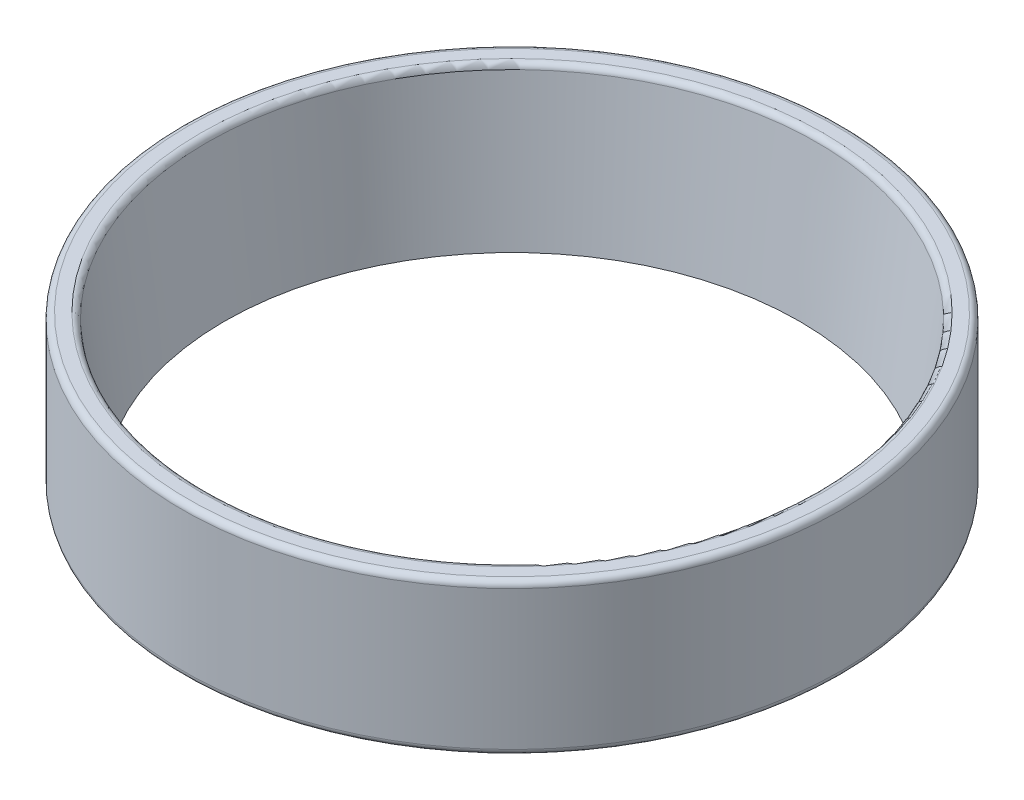
ISO-10303-21;
HEADER;
FILE_DESCRIPTION(('STEP AP214'),'2;1');
FILE_NAME('part.step','',(''),(''),'','','');
FILE_SCHEMA(('AUTOMOTIVE_DESIGN { 1 0 10303 214 1 1 1 1 }'));
ENDSEC;
DATA;
#1=APPLICATION_CONTEXT('core data for automotive mechanical design processes');
#2=APPLICATION_PROTOCOL_DEFINITION('international standard','automotive_design',2000,#1);
#3=PRODUCT_CONTEXT('',#1,'mechanical');
#4=PRODUCT('Part','Part','',(#3));
#5=PRODUCT_RELATED_PRODUCT_CATEGORY('part','',(#4));
#6=PRODUCT_DEFINITION_FORMATION('','',#4);
#7=PRODUCT_DEFINITION_CONTEXT('part definition',#1,'design');
#8=PRODUCT_DEFINITION('design','',#6,#7);
#9=PRODUCT_DEFINITION_SHAPE('','',#8);
#10=(LENGTH_UNIT() NAMED_UNIT(*) SI_UNIT(.MILLI.,.METRE.));
#11=(NAMED_UNIT(*) PLANE_ANGLE_UNIT() SI_UNIT($,.RADIAN.));
#12=(NAMED_UNIT(*) SI_UNIT($,.STERADIAN.) SOLID_ANGLE_UNIT());
#13=UNCERTAINTY_MEASURE_WITH_UNIT(LENGTH_MEASURE(1.E-05),#10,'distance_accuracy_value','');
#14=(GEOMETRIC_REPRESENTATION_CONTEXT(3) GLOBAL_UNCERTAINTY_ASSIGNED_CONTEXT((#13)) GLOBAL_UNIT_ASSIGNED_CONTEXT((#10,
#11,#12)) REPRESENTATION_CONTEXT('',''));
#15=CARTESIAN_POINT('',(0.,0.,0.));
#16=DIRECTION('',(0.,0.,1.));
#17=DIRECTION('',(1.,0.,0.));
#18=AXIS2_PLACEMENT_3D('',#15,#16,#17);
#19=CARTESIAN_POINT('',(0.,18.378788658111,4.44089209850063E-13));
#20=DIRECTION('',(0.,1.,0.));
#21=DIRECTION('',(-1.,0.,0.));
#22=AXIS2_PLACEMENT_3D('',#19,#20,#21);
#23=CONICAL_SURFACE('',#22,38.4004546389734,0.119428926018338);
#24=CARTESIAN_POINT('',(0.,18.378788658111,4.44089209850063E-13));
#25=DIRECTION('',(0.,1.,0.));
#26=DIRECTION('',(-1.,0.,0.));
#27=AXIS2_PLACEMENT_3D('',#24,#25,#26);
#28=CIRCLE('',#27,38.4004546389733);
#29=CARTESIAN_POINT('',(-38.4004546389734,18.378788658111,4.44089209850063E-13));
#30=VERTEX_POINT('',#29);
#31=EDGE_CURVE('E151',#30,#30,#28,.F.);
#32=ORIENTED_EDGE('',*,*,#31,.F.);
#33=EDGE_LOOP('',(#32));
#34=FACE_BOUND('',#33,.T.);
#35=CARTESIAN_POINT('',(0.,0.,0.));
#36=DIRECTION('',(0.,1.,0.));
#37=DIRECTION('',(-1.,0.,0.));
#38=AXIS2_PLACEMENT_3D('',#35,#36,#37);
#39=CIRCLE('',#38,36.195);
#40=CARTESIAN_POINT('',(-36.195,0.,0.));
#41=VERTEX_POINT('',#40);
#42=EDGE_CURVE('E148',#41,#41,#39,.T.);
#43=ORIENTED_EDGE('',*,*,#42,.F.);
#44=EDGE_LOOP('',(#43));
#45=FACE_BOUND('',#44,.T.);
#46=ADVANCED_FACE('F17',(#34,#45),#23,.F.);
#47=CARTESIAN_POINT('',(0.,18.2880000000002,4.44089209850063E-13));
#48=DIRECTION('',(0.,1.,0.));
#49=DIRECTION('',(-1.,0.,0.));
#50=AXIS2_PLACEMENT_3D('',#47,#48,#49);
#51=TOROIDAL_SURFACE('',#50,39.1570267899,0.762);
#52=ORIENTED_EDGE('',*,*,#31,.T.);
#53=EDGE_LOOP('',(#52));
#54=FACE_BOUND('',#53,.T.);
#55=CARTESIAN_POINT('',(0.,19.0500000000002,4.43793113369395E-13));
#56=DIRECTION('',(0.,1.,0.));
#57=DIRECTION('',(-1.,0.,0.));
#58=AXIS2_PLACEMENT_3D('',#55,#56,#57);
#59=CIRCLE('',#58,39.1570267899);
#60=CARTESIAN_POINT('',(39.1570267899009,19.0499999999999,0.));
#61=VERTEX_POINT('',#60);
#62=CARTESIAN_POINT('',(-39.1570267899004,19.0500000000001,8.88178419700125E-13));
#63=VERTEX_POINT('',#62);
#64=EDGE_CURVE('E52',#61,#63,#59,.F.);
#65=ORIENTED_EDGE('',*,*,#64,.F.);
#66=CARTESIAN_POINT('',(0.,19.0500000000002,4.43793113369395E-13));
#67=DIRECTION('',(0.,1.,0.));
#68=DIRECTION('',(1.,0.,0.));
#69=AXIS2_PLACEMENT_3D('',#66,#67,#68);
#70=CIRCLE('',#69,39.1570267899);
#71=EDGE_CURVE('E50',#63,#61,#70,.F.);
#72=ORIENTED_EDGE('',*,*,#71,.F.);
#73=EDGE_LOOP('',(#65,#72));
#74=FACE_BOUND('',#73,.T.);
#75=ADVANCED_FACE('F54',(#54,#74),#51,.T.);
#76=CARTESIAN_POINT('',(-41.4654999999997,4.44089209850063E-13,4.44089209850063E-13));
#77=DIRECTION('',(0.,-1.,0.));
#78=DIRECTION('',(1.,0.,0.));
#79=AXIS2_PLACEMENT_3D('',#76,#77,#78);
#80=PLANE('',#79);
#81=ORIENTED_EDGE('',*,*,#42,.T.);
#82=EDGE_LOOP('',(#81));
#83=FACE_BOUND('',#82,.T.);
#84=CARTESIAN_POINT('',(3.32855409901356E-13,0.,4.4438530633073E-13));
#85=DIRECTION('',(0.,1.,0.));
#86=DIRECTION('',(-1.,0.,0.));
#87=AXIS2_PLACEMENT_3D('',#84,#85,#86);
#88=CIRCLE('',#87,40.7034999999999);
#89=CARTESIAN_POINT('',(-40.7035000000003,3.33066907387547E-13,4.44089209850063E-13));
#90=VERTEX_POINT('',#89);
#91=CARTESIAN_POINT('',(40.7035000000011,-4.44089209850063E-13,1.33226762955019E-12));
#92=VERTEX_POINT('',#91);
#93=EDGE_CURVE('E61',#90,#92,#88,.T.);
#94=ORIENTED_EDGE('',*,*,#93,.F.);
#95=CARTESIAN_POINT('',(3.32855409901356E-13,0.,4.4438530633073E-13));
#96=DIRECTION('',(0.,1.,0.));
#97=DIRECTION('',(1.,0.,0.));
#98=AXIS2_PLACEMENT_3D('',#95,#96,#97);
#99=CIRCLE('',#98,40.7034999999999);
#100=EDGE_CURVE('E177',#92,#90,#99,.T.);
#101=ORIENTED_EDGE('',*,*,#100,.F.);
#102=EDGE_LOOP('',(#94,#101));
#103=FACE_BOUND('',#102,.T.);
#104=ADVANCED_FACE('F80',(#83,#103),#80,.T.);
#105=CARTESIAN_POINT('',(-41.4654999999997,19.0500000000003,4.44089209850063E-13));
#106=DIRECTION('',(0.,1.,0.));
#107=DIRECTION('',(-1.,0.,0.));
#108=AXIS2_PLACEMENT_3D('',#105,#106,#107);
#109=PLANE('',#108);
#110=CARTESIAN_POINT('',(0.,19.0500000000004,4.43793113369395E-13));
#111=DIRECTION('',(0.,-1.,0.));
#112=DIRECTION('',(1.,0.,0.));
#113=AXIS2_PLACEMENT_3D('',#110,#111,#112);
#114=CIRCLE('',#113,40.7034999999995);
#115=CARTESIAN_POINT('',(-40.7034999999999,19.0500000000001,4.44089209850063E-13));
#116=VERTEX_POINT('',#115);
#117=CARTESIAN_POINT('',(40.7035000000007,19.0499999999999,1.33226762955019E-12));
#118=VERTEX_POINT('',#117);
#119=EDGE_CURVE('E35',#116,#118,#114,.F.);
#120=ORIENTED_EDGE('',*,*,#119,.T.);
#121=CARTESIAN_POINT('',(0.,19.0500000000004,4.43793113369395E-13));
#122=DIRECTION('',(0.,-1.,0.));
#123=DIRECTION('',(-1.,0.,0.));
#124=AXIS2_PLACEMENT_3D('',#121,#122,#123);
#125=CIRCLE('',#124,40.7034999999995);
#126=EDGE_CURVE('E101',#116,#118,#125,.T.);
#127=ORIENTED_EDGE('',*,*,#126,.F.);
#128=EDGE_LOOP('',(#120,#127));
#129=FACE_BOUND('',#128,.T.);
#130=ORIENTED_EDGE('',*,*,#71,.T.);
#131=ORIENTED_EDGE('',*,*,#64,.T.);
#132=EDGE_LOOP('',(#130,#131));
#133=FACE_BOUND('',#132,.T.);
#134=ADVANCED_FACE('F60',(#129,#133),#109,.T.);
#135=CARTESIAN_POINT('',(3.33066907387547E-13,0.762000000000052,4.44089209850063E-13));
#136=DIRECTION('',(0.,-1.,0.));
#137=DIRECTION('',(1.,0.,0.));
#138=AXIS2_PLACEMENT_3D('',#135,#136,#137);
#139=TOROIDAL_SURFACE('',#138,40.7034999999999,0.762);
#140=CARTESIAN_POINT('',(3.33066907387547E-13,0.76200000000004,4.44089209850063E-13));
#141=DIRECTION('',(0.,1.,0.));
#142=DIRECTION('',(-1.,0.,0.));
#143=AXIS2_PLACEMENT_3D('',#140,#141,#142);
#144=CIRCLE('',#143,41.4655);
#145=CARTESIAN_POINT('',(-41.4654999999997,0.762000000000028,4.44089209850063E-13));
#146=VERTEX_POINT('',#145);
#147=EDGE_CURVE('E27',#146,#146,#144,.T.);
#148=ORIENTED_EDGE('',*,*,#147,.F.);
#149=EDGE_LOOP('',(#148));
#150=FACE_BOUND('',#149,.T.);
#151=ORIENTED_EDGE('',*,*,#100,.T.);
#152=ORIENTED_EDGE('',*,*,#93,.T.);
#153=EDGE_LOOP('',(#151,#152));
#154=FACE_BOUND('',#153,.T.);
#155=ADVANCED_FACE('F79',(#150,#154),#139,.T.);
#156=CARTESIAN_POINT('',(0.,18.2880000000004,4.44089209850063E-13));
#157=DIRECTION('',(0.,1.,0.));
#158=DIRECTION('',(-1.,0.,0.));
#159=AXIS2_PLACEMENT_3D('',#156,#157,#158);
#160=TOROIDAL_SURFACE('',#159,40.7034999999995,0.762);
#161=ORIENTED_EDGE('',*,*,#126,.T.);
#162=ORIENTED_EDGE('',*,*,#119,.F.);
#163=EDGE_LOOP('',(#161,#162));
#164=FACE_BOUND('',#163,.T.);
#165=CARTESIAN_POINT('',(0.,18.2880000000003,4.44089209850063E-13));
#166=DIRECTION('',(0.,1.,0.));
#167=DIRECTION('',(-1.,0.,0.));
#168=AXIS2_PLACEMENT_3D('',#165,#166,#167);
#169=CIRCLE('',#168,41.4655);
#170=CARTESIAN_POINT('',(-41.4655,18.2880000000003,4.44089209850063E-13));
#171=VERTEX_POINT('',#170);
#172=EDGE_CURVE('E11',#171,#171,#169,.F.);
#173=ORIENTED_EDGE('',*,*,#172,.F.);
#174=EDGE_LOOP('',(#173));
#175=FACE_BOUND('',#174,.T.);
#176=ADVANCED_FACE('F115',(#164,#175),#160,.T.);
#177=CARTESIAN_POINT('',(1.11022302462516E-13,84.0370253164557,4.44089209850063E-13));
#178=DIRECTION('',(0.,1.,0.));
#179=DIRECTION('',(-1.,0.,0.));
#180=AXIS2_PLACEMENT_3D('',#177,#178,#179);
#181=CYLINDRICAL_SURFACE('',#180,41.4655);
#182=ORIENTED_EDGE('',*,*,#147,.T.);
#183=EDGE_LOOP('',(#182));
#184=FACE_BOUND('',#183,.T.);
#185=ORIENTED_EDGE('',*,*,#172,.T.);
#186=EDGE_LOOP('',(#185));
#187=FACE_BOUND('',#186,.T.);
#188=ADVANCED_FACE('F124',(#184,#187),#181,.T.);
#189=CLOSED_SHELL('',(#46,#75,#104,#134,#155,#176,#188));
#190=MANIFOLD_SOLID_BREP('B1',#189);
#191=ADVANCED_BREP_SHAPE_REPRESENTATION('',(#18,#190),#14);
#192=SHAPE_DEFINITION_REPRESENTATION(#9,#191);
ENDSEC;
END-ISO-10303-21;
